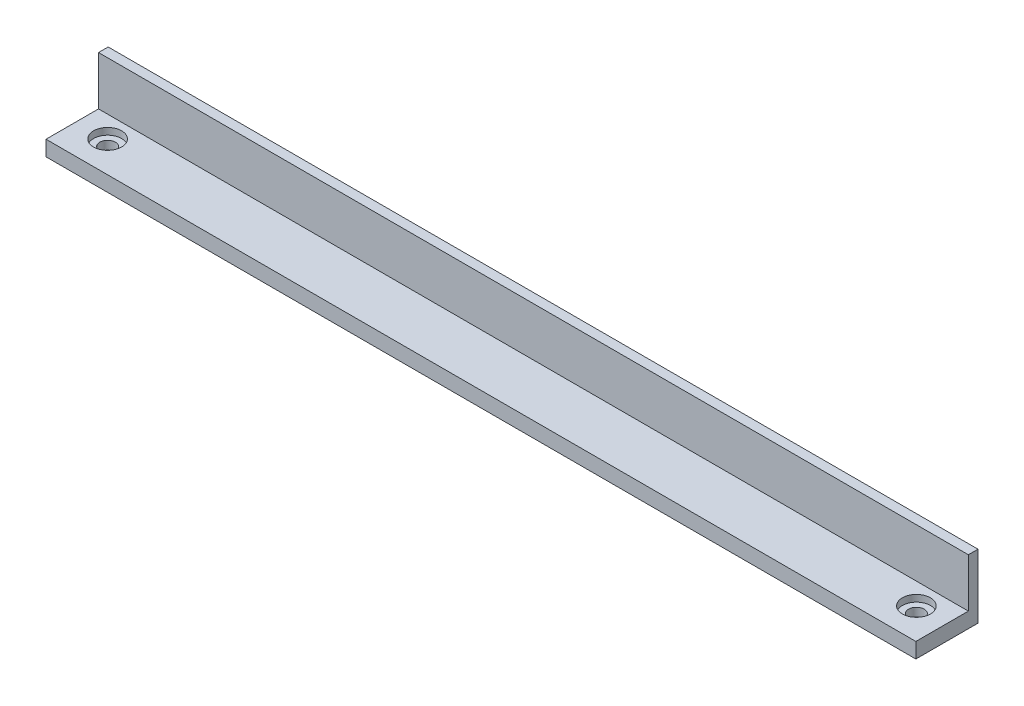
ISO-10303-21;
HEADER;
FILE_DESCRIPTION(('STEP AP214'),'2;1');
FILE_NAME('part.step','',(''),(''),'','','');
FILE_SCHEMA(('AUTOMOTIVE_DESIGN { 1 0 10303 214 1 1 1 1 }'));
ENDSEC;
DATA;
#1=APPLICATION_CONTEXT('core data for automotive mechanical design processes');
#2=APPLICATION_PROTOCOL_DEFINITION('international standard','automotive_design',2000,#1);
#3=PRODUCT_CONTEXT('',#1,'mechanical');
#4=PRODUCT('Part','Part','',(#3));
#5=PRODUCT_RELATED_PRODUCT_CATEGORY('part','',(#4));
#6=PRODUCT_DEFINITION_FORMATION('','',#4);
#7=PRODUCT_DEFINITION_CONTEXT('part definition',#1,'design');
#8=PRODUCT_DEFINITION('design','',#6,#7);
#9=PRODUCT_DEFINITION_SHAPE('','',#8);
#10=(LENGTH_UNIT() NAMED_UNIT(*) SI_UNIT(.MILLI.,.METRE.));
#11=(NAMED_UNIT(*) PLANE_ANGLE_UNIT() SI_UNIT($,.RADIAN.));
#12=(NAMED_UNIT(*) SI_UNIT($,.STERADIAN.) SOLID_ANGLE_UNIT());
#13=UNCERTAINTY_MEASURE_WITH_UNIT(LENGTH_MEASURE(1.E-05),#10,'distance_accuracy_value','');
#14=(GEOMETRIC_REPRESENTATION_CONTEXT(3) GLOBAL_UNCERTAINTY_ASSIGNED_CONTEXT((#13)) GLOBAL_UNIT_ASSIGNED_CONTEXT((#10,
#11,#12)) REPRESENTATION_CONTEXT('',''));
#15=CARTESIAN_POINT('',(0.,0.,0.));
#16=DIRECTION('',(0.,0.,1.));
#17=DIRECTION('',(1.,0.,0.));
#18=AXIS2_PLACEMENT_3D('',#15,#16,#17);
#19=CARTESIAN_POINT('',(-132.5,5.,0.));
#20=DIRECTION('',(0.,-1.,0.));
#21=DIRECTION('',(0.,0.,-1.));
#22=AXIS2_PLACEMENT_3D('',#19,#20,#21);
#23=CYLINDRICAL_SURFACE('',#22,2.54999999999999);
#24=CARTESIAN_POINT('',(-132.5,0.,0.));
#25=DIRECTION('',(0.,1.,0.));
#26=DIRECTION('',(0.,0.,1.));
#27=AXIS2_PLACEMENT_3D('',#24,#25,#26);
#28=CIRCLE('',#27,2.54999999999999);
#29=CARTESIAN_POINT('',(-132.5,0.,2.55000000000002));
#30=VERTEX_POINT('',#29);
#31=EDGE_CURVE('E121',#30,#30,#28,.F.);
#32=ORIENTED_EDGE('',*,*,#31,.T.);
#33=EDGE_LOOP('',(#32));
#34=FACE_BOUND('',#33,.T.);
#35=CARTESIAN_POINT('',(-132.5,2.8,0.));
#36=DIRECTION('',(0.,1.,0.));
#37=DIRECTION('',(0.,0.,1.));
#38=AXIS2_PLACEMENT_3D('',#35,#36,#37);
#39=CIRCLE('',#38,2.54999999999999);
#40=CARTESIAN_POINT('',(-132.5,2.8,2.55000000000002));
#41=VERTEX_POINT('',#40);
#42=EDGE_CURVE('E171',#41,#41,#39,.T.);
#43=ORIENTED_EDGE('',*,*,#42,.T.);
#44=EDGE_LOOP('',(#43));
#45=FACE_BOUND('',#44,.T.);
#46=ADVANCED_FACE('F57',(#34,#45),#23,.F.);
#47=CARTESIAN_POINT('',(132.5,5.,0.));
#48=DIRECTION('',(0.,-1.,0.));
#49=DIRECTION('',(0.,0.,-1.));
#50=AXIS2_PLACEMENT_3D('',#47,#48,#49);
#51=CYLINDRICAL_SURFACE('',#50,2.54999999999999);
#52=CARTESIAN_POINT('',(132.5,0.,0.));
#53=DIRECTION('',(0.,1.,0.));
#54=DIRECTION('',(0.,0.,1.));
#55=AXIS2_PLACEMENT_3D('',#52,#53,#54);
#56=CIRCLE('',#55,2.54999999999999);
#57=CARTESIAN_POINT('',(132.5,0.,2.54999999999999));
#58=VERTEX_POINT('',#57);
#59=EDGE_CURVE('E125',#58,#58,#56,.T.);
#60=ORIENTED_EDGE('',*,*,#59,.F.);
#61=EDGE_LOOP('',(#60));
#62=FACE_BOUND('',#61,.T.);
#63=CARTESIAN_POINT('',(132.5,2.8,0.));
#64=DIRECTION('',(0.,1.,0.));
#65=DIRECTION('',(0.,0.,1.));
#66=AXIS2_PLACEMENT_3D('',#63,#64,#65);
#67=CIRCLE('',#66,2.54999999999999);
#68=CARTESIAN_POINT('',(132.5,2.8,2.54999999999999));
#69=VERTEX_POINT('',#68);
#70=EDGE_CURVE('E168',#69,#69,#67,.T.);
#71=ORIENTED_EDGE('',*,*,#70,.T.);
#72=EDGE_LOOP('',(#71));
#73=FACE_BOUND('',#72,.T.);
#74=ADVANCED_FACE('F199',(#62,#73),#51,.F.);
#75=CARTESIAN_POINT('',(0.,5.,0.));
#76=DIRECTION('',(0.,1.,0.));
#77=DIRECTION('',(0.,0.,1.));
#78=AXIS2_PLACEMENT_3D('',#75,#76,#77);
#79=PLANE('',#78);
#80=CARTESIAN_POINT('',(-132.5,5.,0.));
#81=DIRECTION('',(0.,1.,0.));
#82=DIRECTION('',(0.,0.,1.));
#83=AXIS2_PLACEMENT_3D('',#80,#81,#82);
#84=CIRCLE('',#83,4.59999999999999);
#85=CARTESIAN_POINT('',(-132.5,5.,4.60000000000002));
#86=VERTEX_POINT('',#85);
#87=EDGE_CURVE('E174',#86,#86,#84,.T.);
#88=ORIENTED_EDGE('',*,*,#87,.F.);
#89=EDGE_LOOP('',(#88));
#90=FACE_BOUND('',#89,.T.);
#91=CARTESIAN_POINT('',(132.5,5.,0.));
#92=DIRECTION('',(0.,1.,0.));
#93=DIRECTION('',(0.,0.,1.));
#94=AXIS2_PLACEMENT_3D('',#91,#92,#93);
#95=CIRCLE('',#94,4.59999999999999);
#96=CARTESIAN_POINT('',(132.5,5.,4.59999999999999));
#97=VERTEX_POINT('',#96);
#98=EDGE_CURVE('E164',#97,#97,#95,.T.);
#99=ORIENTED_EDGE('',*,*,#98,.F.);
#100=EDGE_LOOP('',(#99));
#101=FACE_BOUND('',#100,.T.);
#102=DIRECTION('',(0.,0.,-1.));
#103=VECTOR('',#102,1.);
#104=CARTESIAN_POINT('',(142.5,5.,0.));
#105=LINE('',#104,#103);
#106=CARTESIAN_POINT('',(142.5,5.,10.18));
#107=VERTEX_POINT('',#106);
#108=CARTESIAN_POINT('',(142.5,5.,-7.02));
#109=VERTEX_POINT('',#108);
#110=EDGE_CURVE('E145',#107,#109,#105,.T.);
#111=ORIENTED_EDGE('',*,*,#110,.T.);
#112=DIRECTION('',(-1.,0.,0.));
#113=VECTOR('',#112,1.);
#114=CARTESIAN_POINT('',(0.,5.,-7.02));
#115=LINE('',#114,#113);
#116=CARTESIAN_POINT('',(-142.5,5.,-7.02));
#117=VERTEX_POINT('',#116);
#118=EDGE_CURVE('E153',#109,#117,#115,.T.);
#119=ORIENTED_EDGE('',*,*,#118,.T.);
#120=DIRECTION('',(0.,0.,-1.));
#121=VECTOR('',#120,1.);
#122=CARTESIAN_POINT('',(-142.5,5.,0.));
#123=LINE('',#122,#121);
#124=CARTESIAN_POINT('',(-142.5,5.,10.18));
#125=VERTEX_POINT('',#124);
#126=EDGE_CURVE('E106',#125,#117,#123,.T.);
#127=ORIENTED_EDGE('',*,*,#126,.F.);
#128=DIRECTION('',(1.,0.,0.));
#129=VECTOR('',#128,1.);
#130=CARTESIAN_POINT('',(0.,5.,10.18));
#131=LINE('',#130,#129);
#132=EDGE_CURVE('E103',#125,#107,#131,.T.);
#133=ORIENTED_EDGE('',*,*,#132,.T.);
#134=EDGE_LOOP('',(#111,#119,#127,#133));
#135=FACE_BOUND('',#134,.T.);
#136=ADVANCED_FACE('F196',(#90,#101,#135),#79,.T.);
#137=CARTESIAN_POINT('',(0.,5.,10.18));
#138=DIRECTION('',(0.,0.,-1.));
#139=DIRECTION('',(-1.,0.,0.));
#140=AXIS2_PLACEMENT_3D('',#137,#138,#139);
#141=PLANE('',#140);
#142=DIRECTION('',(1.,0.,0.));
#143=VECTOR('',#142,1.);
#144=CARTESIAN_POINT('',(0.,0.,10.18));
#145=LINE('',#144,#143);
#146=CARTESIAN_POINT('',(-142.5,0.,10.18));
#147=VERTEX_POINT('',#146);
#148=CARTESIAN_POINT('',(142.5,0.,10.18));
#149=VERTEX_POINT('',#148);
#150=EDGE_CURVE('E101',#147,#149,#145,.T.);
#151=ORIENTED_EDGE('',*,*,#150,.T.);
#152=DIRECTION('',(0.,-1.,0.));
#153=VECTOR('',#152,1.);
#154=CARTESIAN_POINT('',(142.5,5.,10.18));
#155=LINE('',#154,#153);
#156=EDGE_CURVE('E12',#107,#149,#155,.T.);
#157=ORIENTED_EDGE('',*,*,#156,.F.);
#158=ORIENTED_EDGE('',*,*,#132,.F.);
#159=DIRECTION('',(0.,-1.,0.));
#160=VECTOR('',#159,1.);
#161=CARTESIAN_POINT('',(-142.5,5.,10.18));
#162=LINE('',#161,#160);
#163=EDGE_CURVE('E81',#125,#147,#162,.T.);
#164=ORIENTED_EDGE('',*,*,#163,.T.);
#165=EDGE_LOOP('',(#151,#157,#158,#164));
#166=FACE_BOUND('',#165,.T.);
#167=ADVANCED_FACE('F59',(#166),#141,.F.);
#168=CARTESIAN_POINT('',(142.5,5.,0.));
#169=DIRECTION('',(-1.,0.,0.));
#170=DIRECTION('',(0.,0.,1.));
#171=AXIS2_PLACEMENT_3D('',#168,#169,#170);
#172=PLANE('',#171);
#173=DIRECTION('',(0.,0.,-1.));
#174=VECTOR('',#173,1.);
#175=CARTESIAN_POINT('',(142.5,0.,0.));
#176=LINE('',#175,#174);
#177=CARTESIAN_POINT('',(142.5,0.,-10.18));
#178=VERTEX_POINT('',#177);
#179=EDGE_CURVE('E115',#149,#178,#176,.T.);
#180=ORIENTED_EDGE('',*,*,#179,.T.);
#181=DIRECTION('',(0.,-1.,0.));
#182=VECTOR('',#181,1.);
#183=CARTESIAN_POINT('',(142.5,5.,-10.18));
#184=LINE('',#183,#182);
#185=CARTESIAN_POINT('',(142.5,21.,-10.18));
#186=VERTEX_POINT('',#185);
#187=EDGE_CURVE('E65',#186,#178,#184,.T.);
#188=ORIENTED_EDGE('',*,*,#187,.F.);
#189=DIRECTION('',(0.,0.,1.));
#190=VECTOR('',#189,1.);
#191=CARTESIAN_POINT('',(142.5,21.,0.));
#192=LINE('',#191,#190);
#193=CARTESIAN_POINT('',(142.5,21.,-7.02));
#194=VERTEX_POINT('',#193);
#195=EDGE_CURVE('E158',#186,#194,#192,.T.);
#196=ORIENTED_EDGE('',*,*,#195,.T.);
#197=DIRECTION('',(0.,-1.,0.));
#198=VECTOR('',#197,1.);
#199=CARTESIAN_POINT('',(142.5,21.,-7.02));
#200=LINE('',#199,#198);
#201=EDGE_CURVE('E150',#194,#109,#200,.T.);
#202=ORIENTED_EDGE('',*,*,#201,.T.);
#203=ORIENTED_EDGE('',*,*,#110,.F.);
#204=ORIENTED_EDGE('',*,*,#156,.T.);
#205=EDGE_LOOP('',(#180,#188,#196,#202,#203,#204));
#206=FACE_BOUND('',#205,.T.);
#207=ADVANCED_FACE('F142',(#206),#172,.F.);
#208=CARTESIAN_POINT('',(0.,5.,-10.18));
#209=DIRECTION('',(0.,0.,-1.));
#210=DIRECTION('',(-1.,0.,0.));
#211=AXIS2_PLACEMENT_3D('',#208,#209,#210);
#212=PLANE('',#211);
#213=DIRECTION('',(1.,0.,0.));
#214=VECTOR('',#213,1.);
#215=CARTESIAN_POINT('',(0.,0.,-10.18));
#216=LINE('',#215,#214);
#217=CARTESIAN_POINT('',(-142.5,0.,-10.18));
#218=VERTEX_POINT('',#217);
#219=EDGE_CURVE('E122',#218,#178,#216,.T.);
#220=ORIENTED_EDGE('',*,*,#219,.F.);
#221=DIRECTION('',(0.,-1.,0.));
#222=VECTOR('',#221,1.);
#223=CARTESIAN_POINT('',(-142.5,5.,-10.18));
#224=LINE('',#223,#222);
#225=CARTESIAN_POINT('',(-142.5,21.,-10.18));
#226=VERTEX_POINT('',#225);
#227=EDGE_CURVE('E105',#226,#218,#224,.T.);
#228=ORIENTED_EDGE('',*,*,#227,.F.);
#229=DIRECTION('',(-1.,0.,0.));
#230=VECTOR('',#229,1.);
#231=CARTESIAN_POINT('',(0.,21.,-10.18));
#232=LINE('',#231,#230);
#233=EDGE_CURVE('E138',#186,#226,#232,.T.);
#234=ORIENTED_EDGE('',*,*,#233,.F.);
#235=ORIENTED_EDGE('',*,*,#187,.T.);
#236=EDGE_LOOP('',(#220,#228,#234,#235));
#237=FACE_BOUND('',#236,.T.);
#238=ADVANCED_FACE('F135',(#237),#212,.T.);
#239=CARTESIAN_POINT('',(-142.5,5.,0.));
#240=DIRECTION('',(-1.,0.,0.));
#241=DIRECTION('',(0.,0.,1.));
#242=AXIS2_PLACEMENT_3D('',#239,#240,#241);
#243=PLANE('',#242);
#244=DIRECTION('',(0.,0.,-1.));
#245=VECTOR('',#244,1.);
#246=CARTESIAN_POINT('',(-142.5,0.,0.));
#247=LINE('',#246,#245);
#248=EDGE_CURVE('E113',#147,#218,#247,.T.);
#249=ORIENTED_EDGE('',*,*,#248,.F.);
#250=ORIENTED_EDGE('',*,*,#163,.F.);
#251=ORIENTED_EDGE('',*,*,#126,.T.);
#252=DIRECTION('',(0.,-1.,0.));
#253=VECTOR('',#252,1.);
#254=CARTESIAN_POINT('',(-142.5,21.,-7.02));
#255=LINE('',#254,#253);
#256=CARTESIAN_POINT('',(-142.5,21.,-7.02));
#257=VERTEX_POINT('',#256);
#258=EDGE_CURVE('E72',#257,#117,#255,.T.);
#259=ORIENTED_EDGE('',*,*,#258,.F.);
#260=DIRECTION('',(0.,0.,1.));
#261=VECTOR('',#260,1.);
#262=CARTESIAN_POINT('',(-142.5,21.,0.));
#263=LINE('',#262,#261);
#264=EDGE_CURVE('E155',#226,#257,#263,.T.);
#265=ORIENTED_EDGE('',*,*,#264,.F.);
#266=ORIENTED_EDGE('',*,*,#227,.T.);
#267=EDGE_LOOP('',(#249,#250,#251,#259,#265,#266));
#268=FACE_BOUND('',#267,.T.);
#269=ADVANCED_FACE('F117',(#268),#243,.T.);
#270=CARTESIAN_POINT('',(0.,0.,0.));
#271=DIRECTION('',(0.,1.,0.));
#272=DIRECTION('',(0.,0.,1.));
#273=AXIS2_PLACEMENT_3D('',#270,#271,#272);
#274=PLANE('',#273);
#275=ORIENTED_EDGE('',*,*,#150,.F.);
#276=ORIENTED_EDGE('',*,*,#248,.T.);
#277=ORIENTED_EDGE('',*,*,#219,.T.);
#278=ORIENTED_EDGE('',*,*,#179,.F.);
#279=EDGE_LOOP('',(#275,#276,#277,#278));
#280=FACE_BOUND('',#279,.T.);
#281=ORIENTED_EDGE('',*,*,#31,.F.);
#282=EDGE_LOOP('',(#281));
#283=FACE_BOUND('',#282,.T.);
#284=ORIENTED_EDGE('',*,*,#59,.T.);
#285=EDGE_LOOP('',(#284));
#286=FACE_BOUND('',#285,.T.);
#287=ADVANCED_FACE('F110',(#280,#283,#286),#274,.F.);
#288=CARTESIAN_POINT('',(0.,21.,-7.02));
#289=DIRECTION('',(0.,0.,1.));
#290=DIRECTION('',(1.,0.,0.));
#291=AXIS2_PLACEMENT_3D('',#288,#289,#290);
#292=PLANE('',#291);
#293=ORIENTED_EDGE('',*,*,#118,.F.);
#294=ORIENTED_EDGE('',*,*,#201,.F.);
#295=DIRECTION('',(-1.,0.,0.));
#296=VECTOR('',#295,1.);
#297=CARTESIAN_POINT('',(0.,21.,-7.02));
#298=LINE('',#297,#296);
#299=EDGE_CURVE('E160',#194,#257,#298,.T.);
#300=ORIENTED_EDGE('',*,*,#299,.T.);
#301=ORIENTED_EDGE('',*,*,#258,.T.);
#302=EDGE_LOOP('',(#293,#294,#300,#301));
#303=FACE_BOUND('',#302,.T.);
#304=ADVANCED_FACE('F208',(#303),#292,.T.);
#305=CARTESIAN_POINT('',(0.,21.,0.));
#306=DIRECTION('',(0.,-1.,0.));
#307=DIRECTION('',(0.,0.,-1.));
#308=AXIS2_PLACEMENT_3D('',#305,#306,#307);
#309=PLANE('',#308);
#310=ORIENTED_EDGE('',*,*,#264,.T.);
#311=ORIENTED_EDGE('',*,*,#299,.F.);
#312=ORIENTED_EDGE('',*,*,#195,.F.);
#313=ORIENTED_EDGE('',*,*,#233,.T.);
#314=EDGE_LOOP('',(#310,#311,#312,#313));
#315=FACE_BOUND('',#314,.T.);
#316=ADVANCED_FACE('F210',(#315),#309,.F.);
#317=CARTESIAN_POINT('',(132.5,2.8,0.));
#318=DIRECTION('',(0.,1.,0.));
#319=DIRECTION('',(0.,0.,1.));
#320=AXIS2_PLACEMENT_3D('',#317,#318,#319);
#321=CYLINDRICAL_SURFACE('',#320,4.59999999999999);
#322=CARTESIAN_POINT('',(132.5,2.8,0.));
#323=DIRECTION('',(0.,1.,0.));
#324=DIRECTION('',(0.,0.,1.));
#325=AXIS2_PLACEMENT_3D('',#322,#323,#324);
#326=CIRCLE('',#325,4.59999999999999);
#327=CARTESIAN_POINT('',(132.5,2.8,4.59999999999999));
#328=VERTEX_POINT('',#327);
#329=EDGE_CURVE('E167',#328,#328,#326,.T.);
#330=ORIENTED_EDGE('',*,*,#329,.F.);
#331=EDGE_LOOP('',(#330));
#332=FACE_BOUND('',#331,.T.);
#333=ORIENTED_EDGE('',*,*,#98,.T.);
#334=EDGE_LOOP('',(#333));
#335=FACE_BOUND('',#334,.T.);
#336=ADVANCED_FACE('F216',(#332,#335),#321,.F.);
#337=CARTESIAN_POINT('',(132.5,2.8,0.));
#338=DIRECTION('',(0.,1.,0.));
#339=DIRECTION('',(0.,0.,1.));
#340=AXIS2_PLACEMENT_3D('',#337,#338,#339);
#341=PLANE('',#340);
#342=ORIENTED_EDGE('',*,*,#70,.F.);
#343=EDGE_LOOP('',(#342));
#344=FACE_BOUND('',#343,.T.);
#345=ORIENTED_EDGE('',*,*,#329,.T.);
#346=EDGE_LOOP('',(#345));
#347=FACE_BOUND('',#346,.T.);
#348=ADVANCED_FACE('F192',(#344,#347),#341,.T.);
#349=CARTESIAN_POINT('',(-132.5,2.8,0.));
#350=DIRECTION('',(0.,1.,0.));
#351=DIRECTION('',(0.,0.,1.));
#352=AXIS2_PLACEMENT_3D('',#349,#350,#351);
#353=CYLINDRICAL_SURFACE('',#352,4.59999999999999);
#354=CARTESIAN_POINT('',(-132.5,2.8,0.));
#355=DIRECTION('',(0.,1.,0.));
#356=DIRECTION('',(0.,0.,1.));
#357=AXIS2_PLACEMENT_3D('',#354,#355,#356);
#358=CIRCLE('',#357,4.59999999999999);
#359=CARTESIAN_POINT('',(-132.5,2.8,4.60000000000002));
#360=VERTEX_POINT('',#359);
#361=EDGE_CURVE('E156',#360,#360,#358,.T.);
#362=ORIENTED_EDGE('',*,*,#361,.F.);
#363=EDGE_LOOP('',(#362));
#364=FACE_BOUND('',#363,.T.);
#365=ORIENTED_EDGE('',*,*,#87,.T.);
#366=EDGE_LOOP('',(#365));
#367=FACE_BOUND('',#366,.T.);
#368=ADVANCED_FACE('F186',(#364,#367),#353,.F.);
#369=CARTESIAN_POINT('',(-132.5,2.8,0.));
#370=DIRECTION('',(0.,1.,0.));
#371=DIRECTION('',(0.,0.,1.));
#372=AXIS2_PLACEMENT_3D('',#369,#370,#371);
#373=PLANE('',#372);
#374=ORIENTED_EDGE('',*,*,#42,.F.);
#375=EDGE_LOOP('',(#374));
#376=FACE_BOUND('',#375,.T.);
#377=ORIENTED_EDGE('',*,*,#361,.T.);
#378=EDGE_LOOP('',(#377));
#379=FACE_BOUND('',#378,.T.);
#380=ADVANCED_FACE('F183',(#376,#379),#373,.T.);
#381=CLOSED_SHELL('',(#46,#74,#136,#167,#207,#238,#269,#287,#304,#316,#336,#348,#368,#380));
#382=MANIFOLD_SOLID_BREP('B2',#381);
#383=ADVANCED_BREP_SHAPE_REPRESENTATION('',(#18,#382),#14);
#384=SHAPE_DEFINITION_REPRESENTATION(#9,#383);
ENDSEC;
END-ISO-10303-21;
